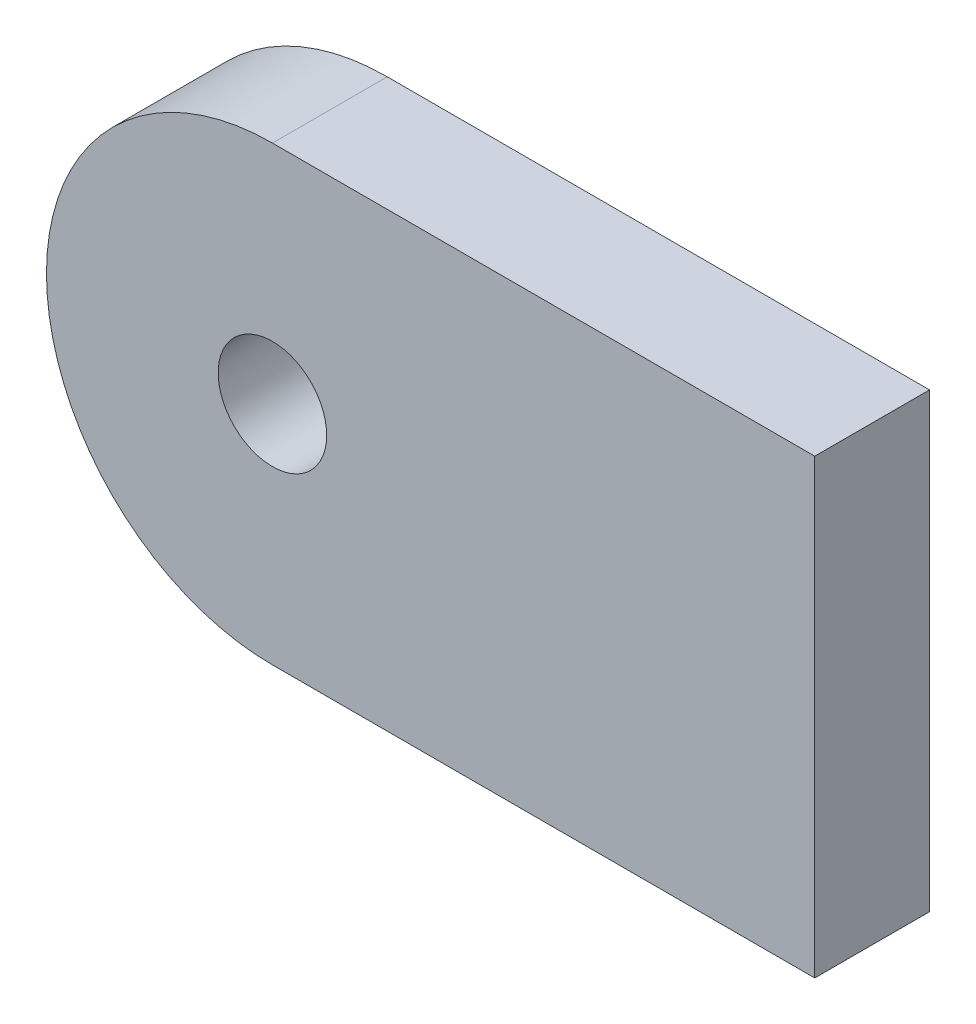
ISO-10303-21;
HEADER;
FILE_DESCRIPTION(('STEP AP214'),'2;1');
FILE_NAME('part.step','',(''),(''),'','','');
FILE_SCHEMA(('AUTOMOTIVE_DESIGN { 1 0 10303 214 1 1 1 1 }'));
ENDSEC;
DATA;
#1=APPLICATION_CONTEXT('core data for automotive mechanical design processes');
#2=APPLICATION_PROTOCOL_DEFINITION('international standard','automotive_design',2000,#1);
#3=PRODUCT_CONTEXT('',#1,'mechanical');
#4=PRODUCT('Part','Part','',(#3));
#5=PRODUCT_RELATED_PRODUCT_CATEGORY('part','',(#4));
#6=PRODUCT_DEFINITION_FORMATION('','',#4);
#7=PRODUCT_DEFINITION_CONTEXT('part definition',#1,'design');
#8=PRODUCT_DEFINITION('design','',#6,#7);
#9=PRODUCT_DEFINITION_SHAPE('','',#8);
#10=(LENGTH_UNIT() NAMED_UNIT(*) SI_UNIT(.MILLI.,.METRE.));
#11=(NAMED_UNIT(*) PLANE_ANGLE_UNIT() SI_UNIT($,.RADIAN.));
#12=(NAMED_UNIT(*) SI_UNIT($,.STERADIAN.) SOLID_ANGLE_UNIT());
#13=UNCERTAINTY_MEASURE_WITH_UNIT(LENGTH_MEASURE(1.E-05),#10,'distance_accuracy_value','');
#14=(GEOMETRIC_REPRESENTATION_CONTEXT(3) GLOBAL_UNCERTAINTY_ASSIGNED_CONTEXT((#13)) GLOBAL_UNIT_ASSIGNED_CONTEXT((#10,
#11,#12)) REPRESENTATION_CONTEXT('',''));
#15=CARTESIAN_POINT('',(0.,0.,0.));
#16=DIRECTION('',(0.,0.,1.));
#17=DIRECTION('',(1.,0.,0.));
#18=AXIS2_PLACEMENT_3D('',#15,#16,#17);
#19=CARTESIAN_POINT('',(-31.6088356551127,13.9212293450309,42.3652666985538));
#20=DIRECTION('',(0.,0.,-1.));
#21=DIRECTION('',(-1.,0.,0.));
#22=AXIS2_PLACEMENT_3D('',#19,#20,#21);
#23=PLANE('',#22);
#24=DIRECTION('',(0.,1.,0.));
#25=VECTOR('',#24,1.);
#26=CARTESIAN_POINT('',(-1.60883565511269,1.42122934503093,42.3652666985538));
#27=LINE('',#26,#25);
#28=CARTESIAN_POINT('',(-1.60883565511269,1.42122934503093,42.3652666985538));
#29=VERTEX_POINT('',#28);
#30=CARTESIAN_POINT('',(-1.60883565511269,26.4212293450309,42.3652666985538));
#31=VERTEX_POINT('',#30);
#32=EDGE_CURVE('E95',#29,#31,#27,.T.);
#33=ORIENTED_EDGE('',*,*,#32,.T.);
#34=DIRECTION('',(-1.,0.,0.));
#35=VECTOR('',#34,1.);
#36=CARTESIAN_POINT('',(-1.60883565511269,26.4212293450309,42.3652666985538));
#37=LINE('',#36,#35);
#38=CARTESIAN_POINT('',(-31.6088356551127,26.4212293450309,42.3652666985538));
#39=VERTEX_POINT('',#38);
#40=EDGE_CURVE('E90',#31,#39,#37,.T.);
#41=ORIENTED_EDGE('',*,*,#40,.T.);
#42=CARTESIAN_POINT('',(-31.6088356551127,13.9212293450309,42.3652666985538));
#43=DIRECTION('',(0.,0.,1.));
#44=DIRECTION('',(-1.,0.,0.));
#45=AXIS2_PLACEMENT_3D('',#42,#43,#44);
#46=CIRCLE('',#45,12.5);
#47=CARTESIAN_POINT('',(-31.6088356551127,1.42122934503092,42.3652666985538));
#48=VERTEX_POINT('',#47);
#49=EDGE_CURVE('E93',#39,#48,#46,.T.);
#50=ORIENTED_EDGE('',*,*,#49,.T.);
#51=DIRECTION('',(1.,0.,0.));
#52=VECTOR('',#51,1.);
#53=CARTESIAN_POINT('',(-1.60883565511269,1.42122934503093,42.3652666985538));
#54=LINE('',#53,#52);
#55=EDGE_CURVE('E60',#48,#29,#54,.T.);
#56=ORIENTED_EDGE('',*,*,#55,.T.);
#57=EDGE_LOOP('',(#33,#41,#50,#56));
#58=FACE_BOUND('',#57,.T.);
#59=CARTESIAN_POINT('',(-31.6088356551127,13.9212293450309,42.3652666985538));
#60=DIRECTION('',(0.,0.,1.));
#61=DIRECTION('',(1.,0.,0.));
#62=AXIS2_PLACEMENT_3D('',#59,#60,#61);
#63=CIRCLE('',#62,3.);
#64=CARTESIAN_POINT('',(-28.6088356551127,13.9212293450309,42.3652666985538));
#65=VERTEX_POINT('',#64);
#66=EDGE_CURVE('E110',#65,#65,#63,.T.);
#67=ORIENTED_EDGE('',*,*,#66,.F.);
#68=EDGE_LOOP('',(#67));
#69=FACE_BOUND('',#68,.T.);
#70=ADVANCED_FACE('F43',(#58,#69),#23,.F.);
#71=CARTESIAN_POINT('',(-31.6088356551127,13.9212293450309,36.0152666985538));
#72=DIRECTION('',(0.,0.,-1.));
#73=DIRECTION('',(-1.,0.,0.));
#74=AXIS2_PLACEMENT_3D('',#71,#72,#73);
#75=PLANE('',#74);
#76=DIRECTION('',(0.,1.,0.));
#77=VECTOR('',#76,1.);
#78=CARTESIAN_POINT('',(-1.60883565511269,1.42122934503093,36.0152666985538));
#79=LINE('',#78,#77);
#80=CARTESIAN_POINT('',(-1.60883565511269,1.42122934503093,36.0152666985538));
#81=VERTEX_POINT('',#80);
#82=CARTESIAN_POINT('',(-1.60883565511269,26.4212293450309,36.0152666985538));
#83=VERTEX_POINT('',#82);
#84=EDGE_CURVE('E107',#81,#83,#79,.T.);
#85=ORIENTED_EDGE('',*,*,#84,.F.);
#86=DIRECTION('',(1.,0.,0.));
#87=VECTOR('',#86,1.);
#88=CARTESIAN_POINT('',(-1.60883565511269,1.42122934503093,36.0152666985538));
#89=LINE('',#88,#87);
#90=CARTESIAN_POINT('',(-31.6088356551127,1.42122934503092,36.0152666985538));
#91=VERTEX_POINT('',#90);
#92=EDGE_CURVE('E83',#91,#81,#89,.T.);
#93=ORIENTED_EDGE('',*,*,#92,.F.);
#94=CARTESIAN_POINT('',(-31.6088356551127,13.9212293450309,36.0152666985538));
#95=DIRECTION('',(0.,0.,1.));
#96=DIRECTION('',(-1.,0.,0.));
#97=AXIS2_PLACEMENT_3D('',#94,#95,#96);
#98=CIRCLE('',#97,12.5);
#99=CARTESIAN_POINT('',(-31.6088356551127,26.4212293450309,36.0152666985538));
#100=VERTEX_POINT('',#99);
#101=EDGE_CURVE('E77',#100,#91,#98,.T.);
#102=ORIENTED_EDGE('',*,*,#101,.F.);
#103=DIRECTION('',(-1.,0.,0.));
#104=VECTOR('',#103,1.);
#105=CARTESIAN_POINT('',(-1.60883565511269,26.4212293450309,36.0152666985538));
#106=LINE('',#105,#104);
#107=EDGE_CURVE('E99',#83,#100,#106,.T.);
#108=ORIENTED_EDGE('',*,*,#107,.F.);
#109=EDGE_LOOP('',(#85,#93,#102,#108));
#110=FACE_BOUND('',#109,.T.);
#111=CARTESIAN_POINT('',(-31.6088356551127,13.9212293450309,36.0152666985538));
#112=DIRECTION('',(0.,0.,1.));
#113=DIRECTION('',(1.,0.,0.));
#114=AXIS2_PLACEMENT_3D('',#111,#112,#113);
#115=CIRCLE('',#114,3.);
#116=CARTESIAN_POINT('',(-28.6088356551127,13.9212293450309,36.0152666985538));
#117=VERTEX_POINT('',#116);
#118=EDGE_CURVE('E122',#117,#117,#115,.T.);
#119=ORIENTED_EDGE('',*,*,#118,.T.);
#120=EDGE_LOOP('',(#119));
#121=FACE_BOUND('',#120,.T.);
#122=ADVANCED_FACE('F118',(#110,#121),#75,.T.);
#123=CARTESIAN_POINT('',(-1.60883565511269,1.42122934503093,42.3652666985538));
#124=DIRECTION('',(-1.,0.,0.));
#125=DIRECTION('',(0.,0.,1.));
#126=AXIS2_PLACEMENT_3D('',#123,#124,#125);
#127=PLANE('',#126);
#128=ORIENTED_EDGE('',*,*,#84,.T.);
#129=DIRECTION('',(0.,0.,-1.));
#130=VECTOR('',#129,1.);
#131=CARTESIAN_POINT('',(-1.60883565511269,26.4212293450309,42.3652666985538));
#132=LINE('',#131,#130);
#133=EDGE_CURVE('E13',#31,#83,#132,.T.);
#134=ORIENTED_EDGE('',*,*,#133,.F.);
#135=ORIENTED_EDGE('',*,*,#32,.F.);
#136=DIRECTION('',(0.,0.,-1.));
#137=VECTOR('',#136,1.);
#138=CARTESIAN_POINT('',(-1.60883565511269,1.42122934503093,42.3652666985538));
#139=LINE('',#138,#137);
#140=EDGE_CURVE('E103',#29,#81,#139,.T.);
#141=ORIENTED_EDGE('',*,*,#140,.T.);
#142=EDGE_LOOP('',(#128,#134,#135,#141));
#143=FACE_BOUND('',#142,.T.);
#144=ADVANCED_FACE('F45',(#143),#127,.F.);
#145=CARTESIAN_POINT('',(-1.60883565511269,26.4212293450309,42.3652666985538));
#146=DIRECTION('',(0.,-1.,0.));
#147=DIRECTION('',(1.,0.,0.));
#148=AXIS2_PLACEMENT_3D('',#145,#146,#147);
#149=PLANE('',#148);
#150=ORIENTED_EDGE('',*,*,#107,.T.);
#151=DIRECTION('',(0.,0.,-1.));
#152=VECTOR('',#151,1.);
#153=CARTESIAN_POINT('',(-31.6088356551127,26.4212293450309,42.3652666985538));
#154=LINE('',#153,#152);
#155=EDGE_CURVE('E52',#39,#100,#154,.T.);
#156=ORIENTED_EDGE('',*,*,#155,.F.);
#157=ORIENTED_EDGE('',*,*,#40,.F.);
#158=ORIENTED_EDGE('',*,*,#133,.T.);
#159=EDGE_LOOP('',(#150,#156,#157,#158));
#160=FACE_BOUND('',#159,.T.);
#161=ADVANCED_FACE('F98',(#160),#149,.F.);
#162=CARTESIAN_POINT('',(-31.6088356551127,13.9212293450309,42.3652666985538));
#163=DIRECTION('',(0.,0.,-1.));
#164=DIRECTION('',(-1.,0.,0.));
#165=AXIS2_PLACEMENT_3D('',#162,#163,#164);
#166=CYLINDRICAL_SURFACE('',#165,12.5);
#167=ORIENTED_EDGE('',*,*,#101,.T.);
#168=DIRECTION('',(0.,0.,-1.));
#169=VECTOR('',#168,1.);
#170=CARTESIAN_POINT('',(-31.6088356551127,1.42122934503092,42.3652666985538));
#171=LINE('',#170,#169);
#172=EDGE_CURVE('E100',#48,#91,#171,.T.);
#173=ORIENTED_EDGE('',*,*,#172,.F.);
#174=ORIENTED_EDGE('',*,*,#49,.F.);
#175=ORIENTED_EDGE('',*,*,#155,.T.);
#176=EDGE_LOOP('',(#167,#173,#174,#175));
#177=FACE_BOUND('',#176,.T.);
#178=ADVANCED_FACE('F101',(#177),#166,.T.);
#179=CARTESIAN_POINT('',(-1.60883565511269,1.42122934503093,42.3652666985538));
#180=DIRECTION('',(0.,1.,0.));
#181=DIRECTION('',(-1.,0.,0.));
#182=AXIS2_PLACEMENT_3D('',#179,#180,#181);
#183=PLANE('',#182);
#184=ORIENTED_EDGE('',*,*,#92,.T.);
#185=ORIENTED_EDGE('',*,*,#140,.F.);
#186=ORIENTED_EDGE('',*,*,#55,.F.);
#187=ORIENTED_EDGE('',*,*,#172,.T.);
#188=EDGE_LOOP('',(#184,#185,#186,#187));
#189=FACE_BOUND('',#188,.T.);
#190=ADVANCED_FACE('F115',(#189),#183,.F.);
#191=CARTESIAN_POINT('',(-31.6088356551127,13.9212293450309,42.3652666985538));
#192=DIRECTION('',(0.,0.,-1.));
#193=DIRECTION('',(-1.,0.,0.));
#194=AXIS2_PLACEMENT_3D('',#191,#192,#193);
#195=CYLINDRICAL_SURFACE('',#194,3.);
#196=ORIENTED_EDGE('',*,*,#66,.T.);
#197=EDGE_LOOP('',(#196));
#198=FACE_BOUND('',#197,.T.);
#199=ORIENTED_EDGE('',*,*,#118,.F.);
#200=EDGE_LOOP('',(#199));
#201=FACE_BOUND('',#200,.T.);
#202=ADVANCED_FACE('F128',(#198,#201),#195,.F.);
#203=CLOSED_SHELL('',(#70,#122,#144,#161,#178,#190,#202));
#204=MANIFOLD_SOLID_BREP('B2',#203);
#205=ADVANCED_BREP_SHAPE_REPRESENTATION('',(#18,#204),#14);
#206=SHAPE_DEFINITION_REPRESENTATION(#9,#205);
ENDSEC;
END-ISO-10303-21;
